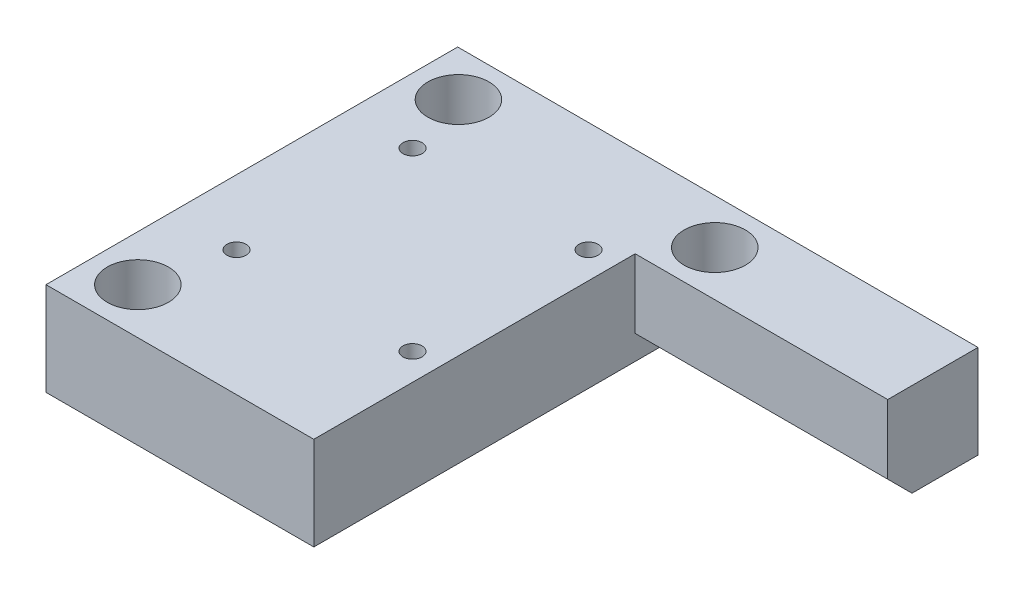
ISO-10303-21;
HEADER;
FILE_DESCRIPTION(('STEP AP214'),'2;1');
FILE_NAME('part.step','',(''),(''),'','','');
FILE_SCHEMA(('AUTOMOTIVE_DESIGN { 1 0 10303 214 1 1 1 1 }'));
ENDSEC;
DATA;
#1=APPLICATION_CONTEXT('core data for automotive mechanical design processes');
#2=APPLICATION_PROTOCOL_DEFINITION('international standard','automotive_design',2000,#1);
#3=PRODUCT_CONTEXT('',#1,'mechanical');
#4=PRODUCT('Part','Part','',(#3));
#5=PRODUCT_RELATED_PRODUCT_CATEGORY('part','',(#4));
#6=PRODUCT_DEFINITION_FORMATION('','',#4);
#7=PRODUCT_DEFINITION_CONTEXT('part definition',#1,'design');
#8=PRODUCT_DEFINITION('design','',#6,#7);
#9=PRODUCT_DEFINITION_SHAPE('','',#8);
#10=(LENGTH_UNIT() NAMED_UNIT(*) SI_UNIT(.MILLI.,.METRE.));
#11=(NAMED_UNIT(*) PLANE_ANGLE_UNIT() SI_UNIT($,.RADIAN.));
#12=(NAMED_UNIT(*) SI_UNIT($,.STERADIAN.) SOLID_ANGLE_UNIT());
#13=UNCERTAINTY_MEASURE_WITH_UNIT(LENGTH_MEASURE(1.E-05),#10,'distance_accuracy_value','');
#14=(GEOMETRIC_REPRESENTATION_CONTEXT(3) GLOBAL_UNCERTAINTY_ASSIGNED_CONTEXT((#13)) GLOBAL_UNIT_ASSIGNED_CONTEXT((#10,
#11,#12)) REPRESENTATION_CONTEXT('',''));
#15=CARTESIAN_POINT('',(0.,0.,0.));
#16=DIRECTION('',(0.,0.,1.));
#17=DIRECTION('',(1.,0.,0.));
#18=AXIS2_PLACEMENT_3D('',#15,#16,#17);
#19=CARTESIAN_POINT('',(0.,-12.192,0.));
#20=DIRECTION('',(-1.,0.,0.));
#21=DIRECTION('',(0.,0.,1.));
#22=AXIS2_PLACEMENT_3D('',#19,#20,#21);
#23=PLANE('',#22);
#24=DIRECTION('',(0.,0.,1.));
#25=VECTOR('',#24,1.);
#26=CARTESIAN_POINT('',(0.,0.,0.));
#27=LINE('',#26,#25);
#28=CARTESIAN_POINT('',(0.,0.,0.));
#29=VERTEX_POINT('',#28);
#30=CARTESIAN_POINT('',(0.,0.,53.8));
#31=VERTEX_POINT('',#30);
#32=EDGE_CURVE('E127',#29,#31,#27,.T.);
#33=ORIENTED_EDGE('',*,*,#32,.F.);
#34=DIRECTION('',(0.,1.,0.));
#35=VECTOR('',#34,1.);
#36=CARTESIAN_POINT('',(0.,-12.192,0.));
#37=LINE('',#36,#35);
#38=CARTESIAN_POINT('',(0.,-12.192,0.));
#39=VERTEX_POINT('',#38);
#40=EDGE_CURVE('E145',#39,#29,#37,.T.);
#41=ORIENTED_EDGE('',*,*,#40,.F.);
#42=DIRECTION('',(0.,0.,1.));
#43=VECTOR('',#42,1.);
#44=CARTESIAN_POINT('',(0.,-12.192,0.));
#45=LINE('',#44,#43);
#46=CARTESIAN_POINT('',(0.,-12.192,53.8));
#47=VERTEX_POINT('',#46);
#48=EDGE_CURVE('E144',#39,#47,#45,.T.);
#49=ORIENTED_EDGE('',*,*,#48,.T.);
#50=DIRECTION('',(0.,1.,0.));
#51=VECTOR('',#50,1.);
#52=CARTESIAN_POINT('',(0.,-12.192,53.8));
#53=LINE('',#52,#51);
#54=EDGE_CURVE('E153',#47,#31,#53,.T.);
#55=ORIENTED_EDGE('',*,*,#54,.T.);
#56=EDGE_LOOP('',(#33,#41,#49,#55));
#57=FACE_BOUND('',#56,.T.);
#58=ADVANCED_FACE('F44',(#57),#23,.T.);
#59=CARTESIAN_POINT('',(68.,-12.192,0.));
#60=DIRECTION('',(0.,0.,-1.));
#61=DIRECTION('',(-1.,0.,0.));
#62=AXIS2_PLACEMENT_3D('',#59,#60,#61);
#63=PLANE('',#62);
#64=DIRECTION('',(-1.,0.,0.));
#65=VECTOR('',#64,1.);
#66=CARTESIAN_POINT('',(68.,0.,0.));
#67=LINE('',#66,#65);
#68=CARTESIAN_POINT('',(68.,0.,0.));
#69=VERTEX_POINT('',#68);
#70=EDGE_CURVE('E135',#69,#29,#67,.T.);
#71=ORIENTED_EDGE('',*,*,#70,.F.);
#72=DIRECTION('',(0.,1.,0.));
#73=VECTOR('',#72,1.);
#74=CARTESIAN_POINT('',(68.,-12.192,0.));
#75=LINE('',#74,#73);
#76=CARTESIAN_POINT('',(68.,-12.192,0.));
#77=VERTEX_POINT('',#76);
#78=EDGE_CURVE('E149',#77,#69,#75,.T.);
#79=ORIENTED_EDGE('',*,*,#78,.F.);
#80=DIRECTION('',(-1.,0.,0.));
#81=VECTOR('',#80,1.);
#82=CARTESIAN_POINT('',(68.,-12.192,0.));
#83=LINE('',#82,#81);
#84=EDGE_CURVE('E155',#77,#39,#83,.T.);
#85=ORIENTED_EDGE('',*,*,#84,.T.);
#86=ORIENTED_EDGE('',*,*,#40,.T.);
#87=EDGE_LOOP('',(#71,#79,#85,#86));
#88=FACE_BOUND('',#87,.T.);
#89=ADVANCED_FACE('F194',(#88),#63,.T.);
#90=CARTESIAN_POINT('',(68.,-12.192,53.8));
#91=DIRECTION('',(1.,0.,0.));
#92=DIRECTION('',(0.,0.,-1.));
#93=AXIS2_PLACEMENT_3D('',#90,#91,#92);
#94=PLANE('',#93);
#95=DIRECTION('',(0.,-1.,0.));
#96=VECTOR('',#95,1.);
#97=CARTESIAN_POINT('',(68.,0.,11.8));
#98=LINE('',#97,#96);
#99=CARTESIAN_POINT('',(68.,0.,11.8));
#100=VERTEX_POINT('',#99);
#101=CARTESIAN_POINT('',(68.,-9.01700000000001,11.8));
#102=VERTEX_POINT('',#101);
#103=EDGE_CURVE('E138',#100,#102,#98,.T.);
#104=ORIENTED_EDGE('',*,*,#103,.T.);
#105=DIRECTION('',(0.,0.707106781186546,0.707106781186549));
#106=VECTOR('',#105,1.);
#107=CARTESIAN_POINT('',(68.,10.3955,31.2125000000001));
#108=LINE('',#107,#106);
#109=CARTESIAN_POINT('',(68.,-12.192,8.62500000000001));
#110=VERTEX_POINT('',#109);
#111=EDGE_CURVE('E67',#102,#110,#108,.F.);
#112=ORIENTED_EDGE('',*,*,#111,.T.);
#113=DIRECTION('',(0.,0.,-1.));
#114=VECTOR('',#113,1.);
#115=CARTESIAN_POINT('',(68.,-12.192,53.8));
#116=LINE('',#115,#114);
#117=EDGE_CURVE('E168',#110,#77,#116,.T.);
#118=ORIENTED_EDGE('',*,*,#117,.T.);
#119=ORIENTED_EDGE('',*,*,#78,.T.);
#120=DIRECTION('',(0.,0.,-1.));
#121=VECTOR('',#120,1.);
#122=CARTESIAN_POINT('',(68.,0.,53.8));
#123=LINE('',#122,#121);
#124=EDGE_CURVE('E129',#100,#69,#123,.T.);
#125=ORIENTED_EDGE('',*,*,#124,.F.);
#126=EDGE_LOOP('',(#104,#112,#118,#119,#125));
#127=FACE_BOUND('',#126,.T.);
#128=ADVANCED_FACE('F198',(#127),#94,.T.);
#129=CARTESIAN_POINT('',(0.,-12.192,53.8));
#130=DIRECTION('',(0.,0.,1.));
#131=DIRECTION('',(1.,0.,0.));
#132=AXIS2_PLACEMENT_3D('',#129,#130,#131);
#133=PLANE('',#132);
#134=DIRECTION('',(0.,-1.,0.));
#135=VECTOR('',#134,1.);
#136=CARTESIAN_POINT('',(35.,0.,53.8));
#137=LINE('',#136,#135);
#138=CARTESIAN_POINT('',(35.,0.,53.8));
#139=VERTEX_POINT('',#138);
#140=CARTESIAN_POINT('',(35.,-12.192,53.8));
#141=VERTEX_POINT('',#140);
#142=EDGE_CURVE('E105',#139,#141,#137,.T.);
#143=ORIENTED_EDGE('',*,*,#142,.F.);
#144=DIRECTION('',(1.,0.,0.));
#145=VECTOR('',#144,1.);
#146=CARTESIAN_POINT('',(0.,0.,53.8));
#147=LINE('',#146,#145);
#148=EDGE_CURVE('E118',#31,#139,#147,.T.);
#149=ORIENTED_EDGE('',*,*,#148,.F.);
#150=ORIENTED_EDGE('',*,*,#54,.F.);
#151=DIRECTION('',(1.,0.,0.));
#152=VECTOR('',#151,1.);
#153=CARTESIAN_POINT('',(0.,-12.192,53.8));
#154=LINE('',#153,#152);
#155=EDGE_CURVE('E121',#47,#141,#154,.T.);
#156=ORIENTED_EDGE('',*,*,#155,.T.);
#157=EDGE_LOOP('',(#143,#149,#150,#156));
#158=FACE_BOUND('',#157,.T.);
#159=ADVANCED_FACE('F117',(#158),#133,.T.);
#160=CARTESIAN_POINT('',(0.,-12.192,0.));
#161=DIRECTION('',(0.,1.,0.));
#162=DIRECTION('',(0.,0.,1.));
#163=AXIS2_PLACEMENT_3D('',#160,#161,#162);
#164=PLANE('',#163);
#165=CARTESIAN_POINT('',(6.,-12.192,47.8));
#166=DIRECTION('',(0.,1.,0.));
#167=DIRECTION('',(0.,0.,1.));
#168=AXIS2_PLACEMENT_3D('',#165,#166,#167);
#169=CIRCLE('',#168,2.4);
#170=CARTESIAN_POINT('',(6.,-12.192,50.2));
#171=VERTEX_POINT('',#170);
#172=EDGE_CURVE('E485',#171,#171,#169,.T.);
#173=ORIENTED_EDGE('',*,*,#172,.T.);
#174=EDGE_LOOP('',(#173));
#175=FACE_BOUND('',#174,.T.);
#176=CARTESIAN_POINT('',(6.,-12.192,5.90000000000001));
#177=DIRECTION('',(0.,1.,0.));
#178=DIRECTION('',(0.,0.,1.));
#179=AXIS2_PLACEMENT_3D('',#176,#177,#178);
#180=CIRCLE('',#179,2.4);
#181=CARTESIAN_POINT('',(6.,-12.192,8.30000000000001));
#182=VERTEX_POINT('',#181);
#183=EDGE_CURVE('E501',#182,#182,#180,.T.);
#184=ORIENTED_EDGE('',*,*,#183,.T.);
#185=EDGE_LOOP('',(#184));
#186=FACE_BOUND('',#185,.T.);
#187=CARTESIAN_POINT('',(39.5,-12.192,5.9));
#188=DIRECTION('',(0.,1.,0.));
#189=DIRECTION('',(0.,0.,1.));
#190=AXIS2_PLACEMENT_3D('',#187,#188,#189);
#191=CIRCLE('',#190,2.4);
#192=CARTESIAN_POINT('',(39.5,-12.192,8.3));
#193=VERTEX_POINT('',#192);
#194=EDGE_CURVE('E517',#193,#193,#191,.T.);
#195=ORIENTED_EDGE('',*,*,#194,.T.);
#196=EDGE_LOOP('',(#195));
#197=FACE_BOUND('',#196,.T.);
#198=CARTESIAN_POINT('',(31.5021834883644,-12.192,14.402424999977));
#199=DIRECTION('',(0.,-1.,0.));
#200=DIRECTION('',(0.,0.,-1.));
#201=AXIS2_PLACEMENT_3D('',#198,#199,#200);
#202=CIRCLE('',#201,1.25);
#203=CARTESIAN_POINT('',(31.5021834883644,-12.192,13.152424999977));
#204=VERTEX_POINT('',#203);
#205=EDGE_CURVE('E521',#204,#204,#202,.T.);
#206=ORIENTED_EDGE('',*,*,#205,.F.);
#207=EDGE_LOOP('',(#206));
#208=FACE_BOUND('',#207,.T.);
#209=CARTESIAN_POINT('',(31.5000000000003,-12.192,37.4046084883411));
#210=DIRECTION('',(0.,-1.,0.));
#211=DIRECTION('',(0.,0.,-1.));
#212=AXIS2_PLACEMENT_3D('',#209,#210,#211);
#213=CIRCLE('',#212,1.25);
#214=CARTESIAN_POINT('',(31.5000000000003,-12.192,36.1546084883411));
#215=VERTEX_POINT('',#214);
#216=EDGE_CURVE('E527',#215,#215,#213,.T.);
#217=ORIENTED_EDGE('',*,*,#216,.F.);
#218=EDGE_LOOP('',(#217));
#219=FACE_BOUND('',#218,.T.);
#220=CARTESIAN_POINT('',(8.50000000000008,-12.192,14.4002415116128));
#221=DIRECTION('',(0.,-1.,0.));
#222=DIRECTION('',(0.,0.,-1.));
#223=AXIS2_PLACEMENT_3D('',#220,#221,#222);
#224=CIRCLE('',#223,1.25);
#225=CARTESIAN_POINT('',(8.50000000000008,-12.192,13.1502415116128));
#226=VERTEX_POINT('',#225);
#227=EDGE_CURVE('E534',#226,#226,#224,.T.);
#228=ORIENTED_EDGE('',*,*,#227,.F.);
#229=EDGE_LOOP('',(#228));
#230=FACE_BOUND('',#229,.T.);
#231=CARTESIAN_POINT('',(8.497816511636,-12.192,37.4024249999771));
#232=DIRECTION('',(0.,-1.,0.));
#233=DIRECTION('',(0.,0.,-1.));
#234=AXIS2_PLACEMENT_3D('',#231,#232,#233);
#235=CIRCLE('',#234,1.25);
#236=CARTESIAN_POINT('',(8.497816511636,-12.192,36.1524249999771));
#237=VERTEX_POINT('',#236);
#238=EDGE_CURVE('E541',#237,#237,#235,.T.);
#239=ORIENTED_EDGE('',*,*,#238,.F.);
#240=EDGE_LOOP('',(#239));
#241=FACE_BOUND('',#240,.T.);
#242=ORIENTED_EDGE('',*,*,#117,.F.);
#243=DIRECTION('',(-1.,0.,0.));
#244=VECTOR('',#243,1.);
#245=CARTESIAN_POINT('',(0.,-12.192,8.625));
#246=LINE('',#245,#244);
#247=CARTESIAN_POINT('',(35.,-12.192,8.625));
#248=VERTEX_POINT('',#247);
#249=EDGE_CURVE('E53',#110,#248,#246,.T.);
#250=ORIENTED_EDGE('',*,*,#249,.T.);
#251=DIRECTION('',(0.,0.,-1.));
#252=VECTOR('',#251,1.);
#253=CARTESIAN_POINT('',(35.,-12.192,53.8));
#254=LINE('',#253,#252);
#255=EDGE_CURVE('E59',#141,#248,#254,.T.);
#256=ORIENTED_EDGE('',*,*,#255,.F.);
#257=ORIENTED_EDGE('',*,*,#155,.F.);
#258=ORIENTED_EDGE('',*,*,#48,.F.);
#259=ORIENTED_EDGE('',*,*,#84,.F.);
#260=EDGE_LOOP('',(#242,#250,#256,#257,#258,#259));
#261=FACE_BOUND('',#260,.T.);
#262=ADVANCED_FACE('F166',(#175,#186,#197,#208,#219,#230,#241,#261),#164,.F.);
#263=CARTESIAN_POINT('',(0.,0.,0.));
#264=DIRECTION('',(0.,1.,0.));
#265=DIRECTION('',(0.,0.,1.));
#266=AXIS2_PLACEMENT_3D('',#263,#264,#265);
#267=PLANE('',#266);
#268=CARTESIAN_POINT('',(6.,0.,47.8));
#269=DIRECTION('',(0.,1.,0.));
#270=DIRECTION('',(0.,0.,1.));
#271=AXIS2_PLACEMENT_3D('',#268,#269,#270);
#272=CIRCLE('',#271,4.);
#273=CARTESIAN_POINT('',(6.,0.,51.8));
#274=VERTEX_POINT('',#273);
#275=EDGE_CURVE('E473',#274,#274,#272,.T.);
#276=ORIENTED_EDGE('',*,*,#275,.F.);
#277=EDGE_LOOP('',(#276));
#278=FACE_BOUND('',#277,.T.);
#279=CARTESIAN_POINT('',(6.,0.,5.90000000000001));
#280=DIRECTION('',(0.,1.,0.));
#281=DIRECTION('',(0.,0.,1.));
#282=AXIS2_PLACEMENT_3D('',#279,#280,#281);
#283=CIRCLE('',#282,4.);
#284=CARTESIAN_POINT('',(6.,0.,9.90000000000001));
#285=VERTEX_POINT('',#284);
#286=EDGE_CURVE('E489',#285,#285,#283,.T.);
#287=ORIENTED_EDGE('',*,*,#286,.F.);
#288=EDGE_LOOP('',(#287));
#289=FACE_BOUND('',#288,.T.);
#290=CARTESIAN_POINT('',(39.5,0.,5.9));
#291=DIRECTION('',(0.,1.,0.));
#292=DIRECTION('',(0.,0.,1.));
#293=AXIS2_PLACEMENT_3D('',#290,#291,#292);
#294=CIRCLE('',#293,4.);
#295=CARTESIAN_POINT('',(39.5,0.,9.9));
#296=VERTEX_POINT('',#295);
#297=EDGE_CURVE('E505',#296,#296,#294,.T.);
#298=ORIENTED_EDGE('',*,*,#297,.F.);
#299=EDGE_LOOP('',(#298));
#300=FACE_BOUND('',#299,.T.);
#301=CARTESIAN_POINT('',(31.5021834883644,0.,14.402424999977));
#302=DIRECTION('',(0.,-1.,0.));
#303=DIRECTION('',(0.,0.,-1.));
#304=AXIS2_PLACEMENT_3D('',#301,#302,#303);
#305=CIRCLE('',#304,1.24999999999999);
#306=CARTESIAN_POINT('',(31.5021834883644,0.,13.152424999977));
#307=VERTEX_POINT('',#306);
#308=EDGE_CURVE('E524',#307,#307,#305,.T.);
#309=ORIENTED_EDGE('',*,*,#308,.T.);
#310=EDGE_LOOP('',(#309));
#311=FACE_BOUND('',#310,.T.);
#312=CARTESIAN_POINT('',(31.5000000000003,0.,37.4046084883411));
#313=DIRECTION('',(0.,-1.,0.));
#314=DIRECTION('',(0.,0.,-1.));
#315=AXIS2_PLACEMENT_3D('',#312,#313,#314);
#316=CIRCLE('',#315,1.24999999999999);
#317=CARTESIAN_POINT('',(31.5000000000003,0.,36.1546084883411));
#318=VERTEX_POINT('',#317);
#319=EDGE_CURVE('E531',#318,#318,#316,.T.);
#320=ORIENTED_EDGE('',*,*,#319,.T.);
#321=EDGE_LOOP('',(#320));
#322=FACE_BOUND('',#321,.T.);
#323=CARTESIAN_POINT('',(8.50000000000008,0.,14.4002415116128));
#324=DIRECTION('',(0.,-1.,0.));
#325=DIRECTION('',(0.,0.,-1.));
#326=AXIS2_PLACEMENT_3D('',#323,#324,#325);
#327=CIRCLE('',#326,1.25);
#328=CARTESIAN_POINT('',(8.50000000000008,0.,13.1502415116128));
#329=VERTEX_POINT('',#328);
#330=EDGE_CURVE('E537',#329,#329,#327,.T.);
#331=ORIENTED_EDGE('',*,*,#330,.T.);
#332=EDGE_LOOP('',(#331));
#333=FACE_BOUND('',#332,.T.);
#334=CARTESIAN_POINT('',(8.497816511636,0.,37.4024249999771));
#335=DIRECTION('',(0.,-1.,0.));
#336=DIRECTION('',(0.,0.,-1.));
#337=AXIS2_PLACEMENT_3D('',#334,#335,#336);
#338=CIRCLE('',#337,1.25);
#339=CARTESIAN_POINT('',(8.497816511636,0.,36.1524249999771));
#340=VERTEX_POINT('',#339);
#341=EDGE_CURVE('E544',#340,#340,#338,.T.);
#342=ORIENTED_EDGE('',*,*,#341,.T.);
#343=EDGE_LOOP('',(#342));
#344=FACE_BOUND('',#343,.T.);
#345=DIRECTION('',(1.,0.,0.));
#346=VECTOR('',#345,1.);
#347=CARTESIAN_POINT('',(35.,0.,11.8));
#348=LINE('',#347,#346);
#349=CARTESIAN_POINT('',(35.,0.,11.8));
#350=VERTEX_POINT('',#349);
#351=EDGE_CURVE('E112',#350,#100,#348,.T.);
#352=ORIENTED_EDGE('',*,*,#351,.T.);
#353=ORIENTED_EDGE('',*,*,#124,.T.);
#354=ORIENTED_EDGE('',*,*,#70,.T.);
#355=ORIENTED_EDGE('',*,*,#32,.T.);
#356=ORIENTED_EDGE('',*,*,#148,.T.);
#357=DIRECTION('',(0.,0.,-1.));
#358=VECTOR('',#357,1.);
#359=CARTESIAN_POINT('',(35.,0.,53.8));
#360=LINE('',#359,#358);
#361=EDGE_CURVE('E102',#139,#350,#360,.T.);
#362=ORIENTED_EDGE('',*,*,#361,.T.);
#363=EDGE_LOOP('',(#352,#353,#354,#355,#356,#362));
#364=FACE_BOUND('',#363,.T.);
#365=ADVANCED_FACE('F124',(#278,#289,#300,#311,#322,#333,#344,#364),#267,.T.);
#366=CARTESIAN_POINT('',(35.,0.,11.8));
#367=DIRECTION('',(0.,0.,-1.));
#368=DIRECTION('',(-1.,0.,0.));
#369=AXIS2_PLACEMENT_3D('',#366,#367,#368);
#370=PLANE('',#369);
#371=DIRECTION('',(0.,-1.,0.));
#372=VECTOR('',#371,1.);
#373=CARTESIAN_POINT('',(35.,0.,11.8));
#374=LINE('',#373,#372);
#375=CARTESIAN_POINT('',(35.,-9.01700000000001,11.8));
#376=VERTEX_POINT('',#375);
#377=EDGE_CURVE('E107',#350,#376,#374,.T.);
#378=ORIENTED_EDGE('',*,*,#377,.T.);
#379=DIRECTION('',(1.,0.,0.));
#380=VECTOR('',#379,1.);
#381=CARTESIAN_POINT('',(35.,-9.01700000000001,11.8));
#382=LINE('',#381,#380);
#383=EDGE_CURVE('E148',#376,#102,#382,.T.);
#384=ORIENTED_EDGE('',*,*,#383,.T.);
#385=ORIENTED_EDGE('',*,*,#103,.F.);
#386=ORIENTED_EDGE('',*,*,#351,.F.);
#387=EDGE_LOOP('',(#378,#384,#385,#386));
#388=FACE_BOUND('',#387,.T.);
#389=ADVANCED_FACE('F172',(#388),#370,.F.);
#390=CARTESIAN_POINT('',(35.,0.,53.8));
#391=DIRECTION('',(-1.,0.,0.));
#392=DIRECTION('',(0.,0.,1.));
#393=AXIS2_PLACEMENT_3D('',#390,#391,#392);
#394=PLANE('',#393);
#395=ORIENTED_EDGE('',*,*,#255,.T.);
#396=DIRECTION('',(0.,-0.707106781186546,-0.707106781186549));
#397=VECTOR('',#396,1.);
#398=CARTESIAN_POINT('',(35.,16.4915,37.3085000000001));
#399=LINE('',#398,#397);
#400=EDGE_CURVE('E11',#248,#376,#399,.F.);
#401=ORIENTED_EDGE('',*,*,#400,.T.);
#402=ORIENTED_EDGE('',*,*,#377,.F.);
#403=ORIENTED_EDGE('',*,*,#361,.F.);
#404=ORIENTED_EDGE('',*,*,#142,.T.);
#405=EDGE_LOOP('',(#395,#401,#402,#403,#404));
#406=FACE_BOUND('',#405,.T.);
#407=ADVANCED_FACE('F104',(#406),#394,.F.);
#408=CARTESIAN_POINT('',(8.497816511636,-12.192,37.4024249999771));
#409=DIRECTION('',(0.,-1.,0.));
#410=DIRECTION('',(0.,0.,-1.));
#411=AXIS2_PLACEMENT_3D('',#408,#409,#410);
#412=CYLINDRICAL_SURFACE('',#411,1.25);
#413=ORIENTED_EDGE('',*,*,#341,.F.);
#414=EDGE_LOOP('',(#413));
#415=FACE_BOUND('',#414,.T.);
#416=ORIENTED_EDGE('',*,*,#238,.T.);
#417=EDGE_LOOP('',(#416));
#418=FACE_BOUND('',#417,.T.);
#419=ADVANCED_FACE('F251',(#415,#418),#412,.F.);
#420=CARTESIAN_POINT('',(8.50000000000008,-12.192,14.4002415116128));
#421=DIRECTION('',(0.,-1.,0.));
#422=DIRECTION('',(0.,0.,-1.));
#423=AXIS2_PLACEMENT_3D('',#420,#421,#422);
#424=CYLINDRICAL_SURFACE('',#423,1.25);
#425=ORIENTED_EDGE('',*,*,#330,.F.);
#426=EDGE_LOOP('',(#425));
#427=FACE_BOUND('',#426,.T.);
#428=ORIENTED_EDGE('',*,*,#227,.T.);
#429=EDGE_LOOP('',(#428));
#430=FACE_BOUND('',#429,.T.);
#431=ADVANCED_FACE('F259',(#427,#430),#424,.F.);
#432=CARTESIAN_POINT('',(31.5000000000003,-12.192,37.4046084883411));
#433=DIRECTION('',(0.,-1.,0.));
#434=DIRECTION('',(0.,0.,-1.));
#435=AXIS2_PLACEMENT_3D('',#432,#433,#434);
#436=CYLINDRICAL_SURFACE('',#435,1.25);
#437=ORIENTED_EDGE('',*,*,#319,.F.);
#438=EDGE_LOOP('',(#437));
#439=FACE_BOUND('',#438,.T.);
#440=ORIENTED_EDGE('',*,*,#216,.T.);
#441=EDGE_LOOP('',(#440));
#442=FACE_BOUND('',#441,.T.);
#443=ADVANCED_FACE('F268',(#439,#442),#436,.F.);
#444=CARTESIAN_POINT('',(31.5021834883644,-12.192,14.402424999977));
#445=DIRECTION('',(0.,-1.,0.));
#446=DIRECTION('',(0.,0.,-1.));
#447=AXIS2_PLACEMENT_3D('',#444,#445,#446);
#448=CYLINDRICAL_SURFACE('',#447,1.25);
#449=ORIENTED_EDGE('',*,*,#308,.F.);
#450=EDGE_LOOP('',(#449));
#451=FACE_BOUND('',#450,.T.);
#452=ORIENTED_EDGE('',*,*,#205,.T.);
#453=EDGE_LOOP('',(#452));
#454=FACE_BOUND('',#453,.T.);
#455=ADVANCED_FACE('F277',(#451,#454),#448,.F.);
#456=CARTESIAN_POINT('',(39.5,0.,5.9));
#457=DIRECTION('',(0.,1.,0.));
#458=DIRECTION('',(0.,0.,1.));
#459=AXIS2_PLACEMENT_3D('',#456,#457,#458);
#460=CYLINDRICAL_SURFACE('',#459,2.4);
#461=ORIENTED_EDGE('',*,*,#194,.F.);
#462=EDGE_LOOP('',(#461));
#463=FACE_BOUND('',#462,.T.);
#464=CARTESIAN_POINT('',(39.5,-7.,5.9));
#465=DIRECTION('',(0.,1.,0.));
#466=DIRECTION('',(0.,0.,1.));
#467=AXIS2_PLACEMENT_3D('',#464,#465,#466);
#468=CIRCLE('',#467,2.4);
#469=CARTESIAN_POINT('',(39.5,-7.,8.3));
#470=VERTEX_POINT('',#469);
#471=EDGE_CURVE('E513',#470,#470,#468,.T.);
#472=ORIENTED_EDGE('',*,*,#471,.T.);
#473=EDGE_LOOP('',(#472));
#474=FACE_BOUND('',#473,.T.);
#475=ADVANCED_FACE('F286',(#463,#474),#460,.F.);
#476=CARTESIAN_POINT('',(41.9,-7.,5.9));
#477=DIRECTION('',(0.,-1.,0.));
#478=DIRECTION('',(0.,0.,-1.));
#479=AXIS2_PLACEMENT_3D('',#476,#477,#478);
#480=PLANE('',#479);
#481=ORIENTED_EDGE('',*,*,#471,.F.);
#482=EDGE_LOOP('',(#481));
#483=FACE_BOUND('',#482,.T.);
#484=CARTESIAN_POINT('',(39.5,-7.,5.9));
#485=DIRECTION('',(0.,1.,0.));
#486=DIRECTION('',(0.,0.,1.));
#487=AXIS2_PLACEMENT_3D('',#484,#485,#486);
#488=CIRCLE('',#487,4.);
#489=CARTESIAN_POINT('',(39.5,-7.,9.9));
#490=VERTEX_POINT('',#489);
#491=EDGE_CURVE('E509',#490,#490,#488,.T.);
#492=ORIENTED_EDGE('',*,*,#491,.T.);
#493=EDGE_LOOP('',(#492));
#494=FACE_BOUND('',#493,.T.);
#495=ADVANCED_FACE('F295',(#483,#494),#480,.F.);
#496=CARTESIAN_POINT('',(39.5,0.,5.9));
#497=DIRECTION('',(0.,1.,0.));
#498=DIRECTION('',(0.,0.,1.));
#499=AXIS2_PLACEMENT_3D('',#496,#497,#498);
#500=CYLINDRICAL_SURFACE('',#499,4.);
#501=ORIENTED_EDGE('',*,*,#491,.F.);
#502=EDGE_LOOP('',(#501));
#503=FACE_BOUND('',#502,.T.);
#504=ORIENTED_EDGE('',*,*,#297,.T.);
#505=EDGE_LOOP('',(#504));
#506=FACE_BOUND('',#505,.T.);
#507=ADVANCED_FACE('F304',(#503,#506),#500,.F.);
#508=CARTESIAN_POINT('',(6.,0.,5.90000000000001));
#509=DIRECTION('',(0.,1.,0.));
#510=DIRECTION('',(0.,0.,1.));
#511=AXIS2_PLACEMENT_3D('',#508,#509,#510);
#512=CYLINDRICAL_SURFACE('',#511,2.4);
#513=ORIENTED_EDGE('',*,*,#183,.F.);
#514=EDGE_LOOP('',(#513));
#515=FACE_BOUND('',#514,.T.);
#516=CARTESIAN_POINT('',(6.,-7.,5.90000000000001));
#517=DIRECTION('',(0.,1.,0.));
#518=DIRECTION('',(0.,0.,1.));
#519=AXIS2_PLACEMENT_3D('',#516,#517,#518);
#520=CIRCLE('',#519,2.4);
#521=CARTESIAN_POINT('',(6.,-7.,8.30000000000001));
#522=VERTEX_POINT('',#521);
#523=EDGE_CURVE('E497',#522,#522,#520,.T.);
#524=ORIENTED_EDGE('',*,*,#523,.T.);
#525=EDGE_LOOP('',(#524));
#526=FACE_BOUND('',#525,.T.);
#527=ADVANCED_FACE('F313',(#515,#526),#512,.F.);
#528=CARTESIAN_POINT('',(8.4,-7.,5.90000000000001));
#529=DIRECTION('',(0.,-1.,0.));
#530=DIRECTION('',(0.,0.,-1.));
#531=AXIS2_PLACEMENT_3D('',#528,#529,#530);
#532=PLANE('',#531);
#533=ORIENTED_EDGE('',*,*,#523,.F.);
#534=EDGE_LOOP('',(#533));
#535=FACE_BOUND('',#534,.T.);
#536=CARTESIAN_POINT('',(6.,-7.,5.90000000000001));
#537=DIRECTION('',(0.,1.,0.));
#538=DIRECTION('',(0.,0.,1.));
#539=AXIS2_PLACEMENT_3D('',#536,#537,#538);
#540=CIRCLE('',#539,4.);
#541=CARTESIAN_POINT('',(6.,-7.,9.90000000000001));
#542=VERTEX_POINT('',#541);
#543=EDGE_CURVE('E493',#542,#542,#540,.T.);
#544=ORIENTED_EDGE('',*,*,#543,.T.);
#545=EDGE_LOOP('',(#544));
#546=FACE_BOUND('',#545,.T.);
#547=ADVANCED_FACE('F322',(#535,#546),#532,.F.);
#548=CARTESIAN_POINT('',(6.,0.,5.90000000000001));
#549=DIRECTION('',(0.,1.,0.));
#550=DIRECTION('',(0.,0.,1.));
#551=AXIS2_PLACEMENT_3D('',#548,#549,#550);
#552=CYLINDRICAL_SURFACE('',#551,4.);
#553=ORIENTED_EDGE('',*,*,#543,.F.);
#554=EDGE_LOOP('',(#553));
#555=FACE_BOUND('',#554,.T.);
#556=ORIENTED_EDGE('',*,*,#286,.T.);
#557=EDGE_LOOP('',(#556));
#558=FACE_BOUND('',#557,.T.);
#559=ADVANCED_FACE('F331',(#555,#558),#552,.F.);
#560=CARTESIAN_POINT('',(6.,0.,47.8));
#561=DIRECTION('',(0.,1.,0.));
#562=DIRECTION('',(0.,0.,1.));
#563=AXIS2_PLACEMENT_3D('',#560,#561,#562);
#564=CYLINDRICAL_SURFACE('',#563,2.4);
#565=ORIENTED_EDGE('',*,*,#172,.F.);
#566=EDGE_LOOP('',(#565));
#567=FACE_BOUND('',#566,.T.);
#568=CARTESIAN_POINT('',(6.,-7.,47.8));
#569=DIRECTION('',(0.,1.,0.));
#570=DIRECTION('',(0.,0.,1.));
#571=AXIS2_PLACEMENT_3D('',#568,#569,#570);
#572=CIRCLE('',#571,2.4);
#573=CARTESIAN_POINT('',(6.,-7.,50.2));
#574=VERTEX_POINT('',#573);
#575=EDGE_CURVE('E479',#574,#574,#572,.T.);
#576=ORIENTED_EDGE('',*,*,#575,.T.);
#577=EDGE_LOOP('',(#576));
#578=FACE_BOUND('',#577,.T.);
#579=ADVANCED_FACE('F340',(#567,#578),#564,.F.);
#580=CARTESIAN_POINT('',(8.4,-7.,47.8));
#581=DIRECTION('',(0.,-1.,0.));
#582=DIRECTION('',(0.,0.,-1.));
#583=AXIS2_PLACEMENT_3D('',#580,#581,#582);
#584=PLANE('',#583);
#585=ORIENTED_EDGE('',*,*,#575,.F.);
#586=EDGE_LOOP('',(#585));
#587=FACE_BOUND('',#586,.T.);
#588=CARTESIAN_POINT('',(6.,-7.,47.8));
#589=DIRECTION('',(0.,1.,0.));
#590=DIRECTION('',(0.,0.,1.));
#591=AXIS2_PLACEMENT_3D('',#588,#589,#590);
#592=CIRCLE('',#591,4.);
#593=CARTESIAN_POINT('',(6.,-7.,51.8));
#594=VERTEX_POINT('',#593);
#595=EDGE_CURVE('E470',#594,#594,#592,.T.);
#596=ORIENTED_EDGE('',*,*,#595,.T.);
#597=EDGE_LOOP('',(#596));
#598=FACE_BOUND('',#597,.T.);
#599=ADVANCED_FACE('F349',(#587,#598),#584,.F.);
#600=CARTESIAN_POINT('',(6.,0.,47.8));
#601=DIRECTION('',(0.,1.,0.));
#602=DIRECTION('',(0.,0.,1.));
#603=AXIS2_PLACEMENT_3D('',#600,#601,#602);
#604=CYLINDRICAL_SURFACE('',#603,4.);
#605=ORIENTED_EDGE('',*,*,#595,.F.);
#606=EDGE_LOOP('',(#605));
#607=FACE_BOUND('',#606,.T.);
#608=ORIENTED_EDGE('',*,*,#275,.T.);
#609=EDGE_LOOP('',(#608));
#610=FACE_BOUND('',#609,.T.);
#611=ADVANCED_FACE('F358',(#607,#610),#604,.F.);
#612=CARTESIAN_POINT('',(35.,-9.01700000000001,11.8));
#613=DIRECTION('',(0.,0.707106781186549,-0.707106781186546));
#614=DIRECTION('',(1.,0.,0.));
#615=AXIS2_PLACEMENT_3D('',#612,#613,#614);
#616=PLANE('',#615);
#617=ORIENTED_EDGE('',*,*,#400,.F.);
#618=ORIENTED_EDGE('',*,*,#249,.F.);
#619=ORIENTED_EDGE('',*,*,#111,.F.);
#620=ORIENTED_EDGE('',*,*,#383,.F.);
#621=EDGE_LOOP('',(#617,#618,#619,#620));
#622=FACE_BOUND('',#621,.T.);
#623=ADVANCED_FACE('F46',(#622),#616,.F.);
#624=CLOSED_SHELL('',(#58,#89,#128,#159,#262,#365,#389,#407,#419,#431,#443,#455,#475,#495,#507,
#527,#547,#559,#579,#599,#611,#623));
#625=MANIFOLD_SOLID_BREP('B2',#624);
#626=ADVANCED_BREP_SHAPE_REPRESENTATION('',(#18,#625),#14);
#627=SHAPE_DEFINITION_REPRESENTATION(#9,#626);
ENDSEC;
END-ISO-10303-21;
